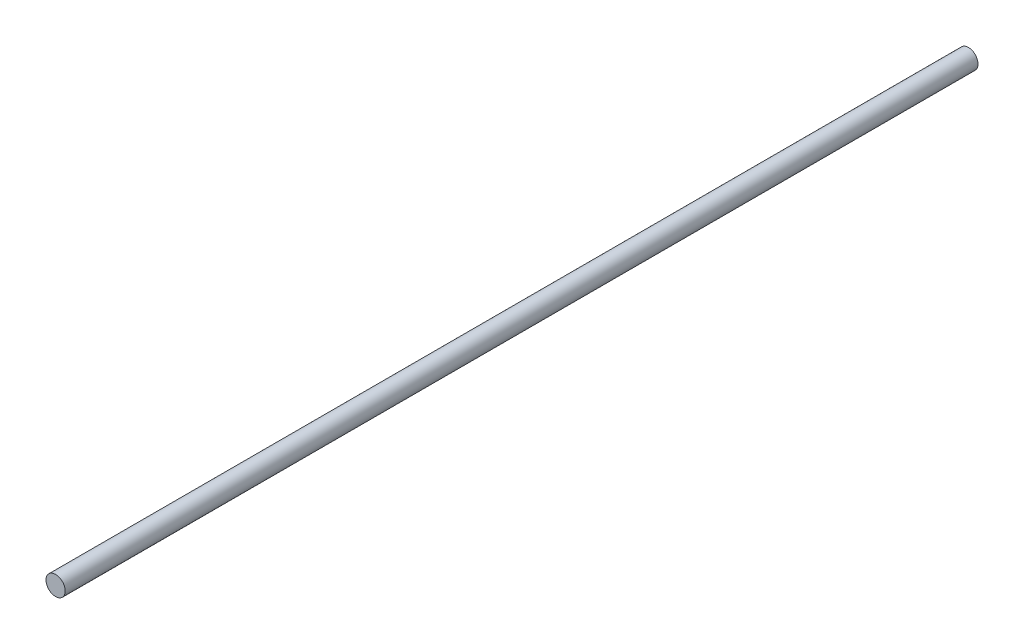
ISO-10303-21;
HEADER;
FILE_DESCRIPTION(('STEP AP214'),'2;1');
FILE_NAME('part.step','',(''),(''),'','','');
FILE_SCHEMA(('AUTOMOTIVE_DESIGN { 1 0 10303 214 1 1 1 1 }'));
ENDSEC;
DATA;
#1=APPLICATION_CONTEXT('core data for automotive mechanical design processes');
#2=APPLICATION_PROTOCOL_DEFINITION('international standard','automotive_design',2000,#1);
#3=PRODUCT_CONTEXT('',#1,'mechanical');
#4=PRODUCT('Part','Part','',(#3));
#5=PRODUCT_RELATED_PRODUCT_CATEGORY('part','',(#4));
#6=PRODUCT_DEFINITION_FORMATION('','',#4);
#7=PRODUCT_DEFINITION_CONTEXT('part definition',#1,'design');
#8=PRODUCT_DEFINITION('design','',#6,#7);
#9=PRODUCT_DEFINITION_SHAPE('','',#8);
#10=(LENGTH_UNIT() NAMED_UNIT(*) SI_UNIT(.MILLI.,.METRE.));
#11=(NAMED_UNIT(*) PLANE_ANGLE_UNIT() SI_UNIT($,.RADIAN.));
#12=(NAMED_UNIT(*) SI_UNIT($,.STERADIAN.) SOLID_ANGLE_UNIT());
#13=UNCERTAINTY_MEASURE_WITH_UNIT(LENGTH_MEASURE(1.E-05),#10,'distance_accuracy_value','');
#14=(GEOMETRIC_REPRESENTATION_CONTEXT(3) GLOBAL_UNCERTAINTY_ASSIGNED_CONTEXT((#13)) GLOBAL_UNIT_ASSIGNED_CONTEXT((#10,
#11,#12)) REPRESENTATION_CONTEXT('',''));
#15=CARTESIAN_POINT('',(0.,0.,0.));
#16=DIRECTION('',(0.,0.,1.));
#17=DIRECTION('',(1.,0.,0.));
#18=AXIS2_PLACEMENT_3D('',#15,#16,#17);
#19=CARTESIAN_POINT('',(0.,0.,475.));
#20=DIRECTION('',(0.,0.,-1.));
#21=DIRECTION('',(-1.,0.,0.));
#22=AXIS2_PLACEMENT_3D('',#19,#20,#21);
#23=CYLINDRICAL_SURFACE('',#22,5.);
#24=CARTESIAN_POINT('',(0.,0.,475.));
#25=DIRECTION('',(0.,0.,1.));
#26=DIRECTION('',(1.,0.,0.));
#27=AXIS2_PLACEMENT_3D('',#24,#25,#26);
#28=CIRCLE('',#27,5.);
#29=CARTESIAN_POINT('',(-5.,0.,475.));
#30=VERTEX_POINT('',#29);
#31=EDGE_CURVE('E10',#30,#30,#28,.T.);
#32=CARTESIAN_POINT('',(0.,0.,0.));
#33=DIRECTION('',(0.,0.,1.));
#34=DIRECTION('',(1.,0.,0.));
#35=AXIS2_PLACEMENT_3D('',#32,#33,#34);
#36=CIRCLE('',#35,5.);
#37=CARTESIAN_POINT('',(-5.,0.,0.));
#38=VERTEX_POINT('',#37);
#39=EDGE_CURVE('E35',#38,#38,#36,.T.);
#40=CARTESIAN_POINT('',(-5.,0.,475.));
#41=CARTESIAN_POINT('',(-5.,0.,470.052083333333));
#42=CARTESIAN_POINT('',(-5.,0.,465.104166666667));
#43=CARTESIAN_POINT('',(-5.,0.,455.208333333333));
#44=CARTESIAN_POINT('',(-5.,0.,450.260416666667));
#45=CARTESIAN_POINT('',(-5.,0.,440.364583333333));
#46=CARTESIAN_POINT('',(-5.,0.,435.416666666667));
#47=CARTESIAN_POINT('',(-5.,0.,425.520833333333));
#48=CARTESIAN_POINT('',(-5.,0.,420.572916666667));
#49=CARTESIAN_POINT('',(-5.,0.,410.677083333333));
#50=CARTESIAN_POINT('',(-5.,0.,405.729166666667));
#51=CARTESIAN_POINT('',(-5.,0.,395.833333333333));
#52=CARTESIAN_POINT('',(-5.,0.,390.885416666667));
#53=CARTESIAN_POINT('',(-5.,0.,380.989583333333));
#54=CARTESIAN_POINT('',(-5.,0.,376.041666666667));
#55=CARTESIAN_POINT('',(-5.,0.,366.145833333333));
#56=CARTESIAN_POINT('',(-5.,0.,361.197916666667));
#57=CARTESIAN_POINT('',(-5.,0.,351.302083333333));
#58=CARTESIAN_POINT('',(-5.,0.,346.354166666667));
#59=CARTESIAN_POINT('',(-5.,0.,336.458333333333));
#60=CARTESIAN_POINT('',(-5.,0.,331.510416666667));
#61=CARTESIAN_POINT('',(-5.,0.,321.614583333333));
#62=CARTESIAN_POINT('',(-5.,0.,316.666666666667));
#63=CARTESIAN_POINT('',(-5.,0.,306.770833333333));
#64=CARTESIAN_POINT('',(-5.,0.,301.822916666667));
#65=CARTESIAN_POINT('',(-5.,0.,291.927083333333));
#66=CARTESIAN_POINT('',(-5.,0.,286.979166666667));
#67=CARTESIAN_POINT('',(-5.,0.,277.083333333333));
#68=CARTESIAN_POINT('',(-5.,0.,272.135416666667));
#69=CARTESIAN_POINT('',(-5.,0.,262.239583333333));
#70=CARTESIAN_POINT('',(-5.,0.,257.291666666667));
#71=CARTESIAN_POINT('',(-5.,0.,247.395833333333));
#72=CARTESIAN_POINT('',(-5.,0.,242.447916666667));
#73=CARTESIAN_POINT('',(-5.,0.,232.552083333333));
#74=CARTESIAN_POINT('',(-5.,0.,227.604166666667));
#75=CARTESIAN_POINT('',(-5.,0.,217.708333333333));
#76=CARTESIAN_POINT('',(-5.,0.,212.760416666667));
#77=CARTESIAN_POINT('',(-5.,0.,202.864583333333));
#78=CARTESIAN_POINT('',(-5.,0.,197.916666666667));
#79=CARTESIAN_POINT('',(-5.,0.,188.020833333333));
#80=CARTESIAN_POINT('',(-5.,0.,183.072916666667));
#81=CARTESIAN_POINT('',(-5.,0.,173.177083333333));
#82=CARTESIAN_POINT('',(-5.,0.,168.229166666667));
#83=CARTESIAN_POINT('',(-5.,0.,158.333333333333));
#84=CARTESIAN_POINT('',(-5.,0.,153.385416666667));
#85=CARTESIAN_POINT('',(-5.,0.,143.489583333333));
#86=CARTESIAN_POINT('',(-5.,0.,138.541666666667));
#87=CARTESIAN_POINT('',(-5.,0.,128.645833333333));
#88=CARTESIAN_POINT('',(-5.,0.,123.697916666667));
#89=CARTESIAN_POINT('',(-5.,0.,113.802083333333));
#90=CARTESIAN_POINT('',(-5.,0.,108.854166666667));
#91=CARTESIAN_POINT('',(-5.,0.,98.9583333333333));
#92=CARTESIAN_POINT('',(-5.,0.,94.0104166666667));
#93=CARTESIAN_POINT('',(-5.,0.,84.1145833333333));
#94=CARTESIAN_POINT('',(-5.,0.,79.1666666666666));
#95=CARTESIAN_POINT('',(-5.,0.,69.2708333333333));
#96=CARTESIAN_POINT('',(-5.,0.,64.3229166666666));
#97=CARTESIAN_POINT('',(-5.,0.,54.4270833333333));
#98=CARTESIAN_POINT('',(-5.,0.,49.4791666666666));
#99=CARTESIAN_POINT('',(-5.,0.,39.5833333333333));
#100=CARTESIAN_POINT('',(-5.,0.,34.6354166666666));
#101=CARTESIAN_POINT('',(-5.,0.,24.7395833333333));
#102=CARTESIAN_POINT('',(-5.,0.,19.7916666666666));
#103=CARTESIAN_POINT('',(-5.,0.,9.89583333333327));
#104=CARTESIAN_POINT('',(-5.,0.,4.9479166666666));
#105=CARTESIAN_POINT('',(-5.,0.,0.));
#106=B_SPLINE_CURVE_WITH_KNOTS('',3,(#40,#41,#42,#43,#44,#45,#46,#47,#48,#49,#50,#51,#52,#53,
#54,#55,#56,#57,#58,#59,#60,#61,#62,#63,#64,#65,#66,#67,#68,#69,#70,#71,#72,#73,#74,#75,#76,#77,
#78,#79,#80,#81,#82,#83,#84,#85,#86,#87,#88,#89,#90,#91,#92,#93,#94,#95,#96,#97,#98,#99,#100,
#101,#102,#103,#104,#105),.UNSPECIFIED.,.F.,.F.,(4,2,2,2,2,2,2,2,2,2,2,2,2,2,2,2,2,2,2,2,2,2,2,
2,2,2,2,2,2,2,2,2,4),(0.,14.84375,29.6875,44.53125,59.375,74.21875,89.0625,103.90625,118.75,
133.59375,148.4375,163.28125,178.125,192.96875,207.8125,222.65625,237.5,252.34375,267.1875,
282.03125,296.875,311.71875,326.5625,341.40625,356.25,371.09375,385.9375,400.78125,415.625,
430.46875,445.3125,460.15625,475.),.UNSPECIFIED.);
#107=EDGE_CURVE('BSEAM32',#30,#38,#106,.T.);
#108=ORIENTED_EDGE('',*,*,#31,.F.);
#109=ORIENTED_EDGE('',*,*,#39,.T.);
#110=ORIENTED_EDGE('',*,*,#107,.T.);
#111=ORIENTED_EDGE('',*,*,#107,.F.);
#112=EDGE_LOOP('',(#108,#110,#109,#111));
#113=FACE_BOUND('',#112,.T.);
#114=ADVANCED_FACE('F32',(#113),#23,.T.);
#115=CARTESIAN_POINT('',(0.,0.,475.));
#116=DIRECTION('',(0.,0.,1.));
#117=DIRECTION('',(1.,0.,0.));
#118=AXIS2_PLACEMENT_3D('',#115,#116,#117);
#119=PLANE('',#118);
#120=ORIENTED_EDGE('',*,*,#31,.T.);
#121=EDGE_LOOP('',(#120));
#122=FACE_BOUND('',#121,.T.);
#123=ADVANCED_FACE('F47',(#122),#119,.T.);
#124=CARTESIAN_POINT('',(0.,0.,0.));
#125=DIRECTION('',(0.,0.,1.));
#126=DIRECTION('',(1.,0.,0.));
#127=AXIS2_PLACEMENT_3D('',#124,#125,#126);
#128=PLANE('',#127);
#129=ORIENTED_EDGE('',*,*,#39,.F.);
#130=EDGE_LOOP('',(#129));
#131=FACE_BOUND('',#130,.T.);
#132=ADVANCED_FACE('F45',(#131),#128,.F.);
#133=CLOSED_SHELL('',(#114,#123,#132));
#134=MANIFOLD_SOLID_BREP('B2',#133);
#135=ADVANCED_BREP_SHAPE_REPRESENTATION('',(#18,#134),#14);
#136=SHAPE_DEFINITION_REPRESENTATION(#9,#135);
ENDSEC;
END-ISO-10303-21;
